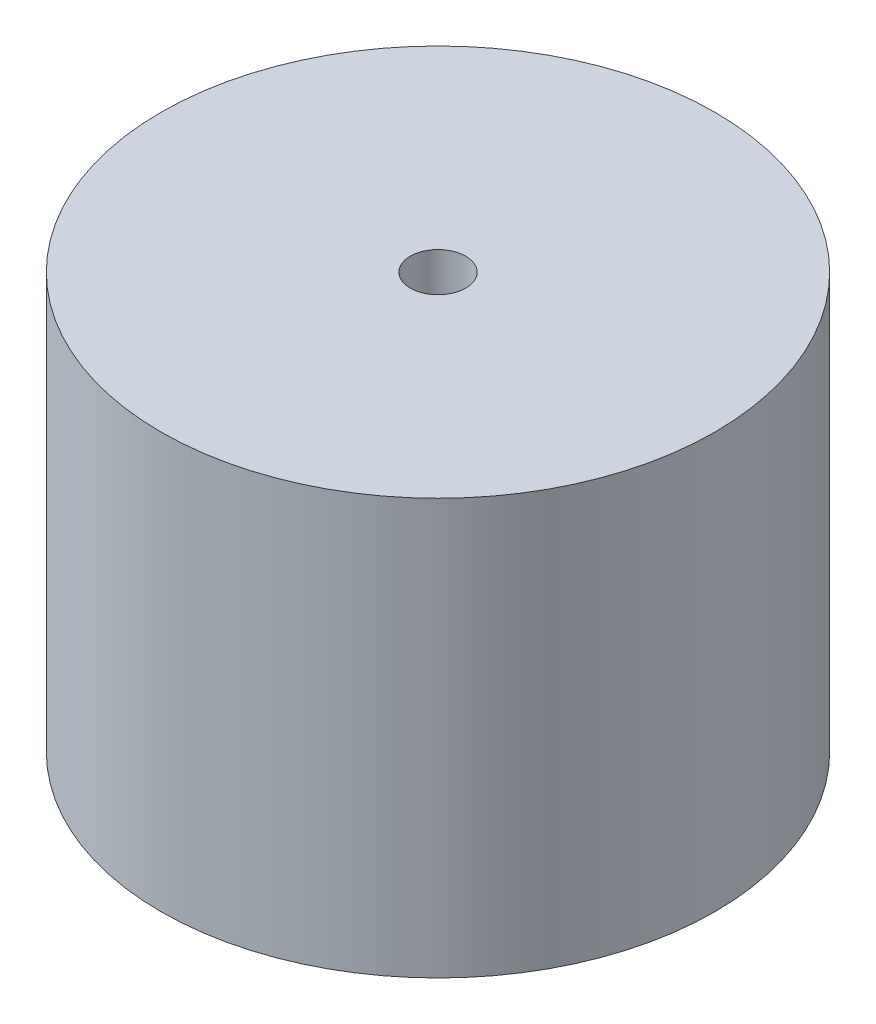
ISO-10303-21;
HEADER;
FILE_DESCRIPTION(('STEP AP214'),'2;1');
FILE_NAME('part.step','',(''),(''),'','','');
FILE_SCHEMA(('AUTOMOTIVE_DESIGN { 1 0 10303 214 1 1 1 1 }'));
ENDSEC;
DATA;
#1=APPLICATION_CONTEXT('core data for automotive mechanical design processes');
#2=APPLICATION_PROTOCOL_DEFINITION('international standard','automotive_design',2000,#1);
#3=PRODUCT_CONTEXT('',#1,'mechanical');
#4=PRODUCT('Part','Part','',(#3));
#5=PRODUCT_RELATED_PRODUCT_CATEGORY('part','',(#4));
#6=PRODUCT_DEFINITION_FORMATION('','',#4);
#7=PRODUCT_DEFINITION_CONTEXT('part definition',#1,'design');
#8=PRODUCT_DEFINITION('design','',#6,#7);
#9=PRODUCT_DEFINITION_SHAPE('','',#8);
#10=(LENGTH_UNIT() NAMED_UNIT(*) SI_UNIT(.MILLI.,.METRE.));
#11=(NAMED_UNIT(*) PLANE_ANGLE_UNIT() SI_UNIT($,.RADIAN.));
#12=(NAMED_UNIT(*) SI_UNIT($,.STERADIAN.) SOLID_ANGLE_UNIT());
#13=UNCERTAINTY_MEASURE_WITH_UNIT(LENGTH_MEASURE(1.E-05),#10,'distance_accuracy_value','');
#14=(GEOMETRIC_REPRESENTATION_CONTEXT(3) GLOBAL_UNCERTAINTY_ASSIGNED_CONTEXT((#13)) GLOBAL_UNIT_ASSIGNED_CONTEXT((#10,
#11,#12)) REPRESENTATION_CONTEXT('',''));
#15=CARTESIAN_POINT('',(0.,0.,0.));
#16=DIRECTION('',(0.,0.,1.));
#17=DIRECTION('',(1.,0.,0.));
#18=AXIS2_PLACEMENT_3D('',#15,#16,#17);
#19=CARTESIAN_POINT('',(0.,7.5,0.));
#20=DIRECTION('',(0.,-1.,0.));
#21=DIRECTION('',(0.,0.,-1.));
#22=AXIS2_PLACEMENT_3D('',#19,#20,#21);
#23=CYLINDRICAL_SURFACE('',#22,5.);
#24=CARTESIAN_POINT('',(0.,7.5,0.));
#25=DIRECTION('',(0.,1.,0.));
#26=DIRECTION('',(0.,0.,1.));
#27=AXIS2_PLACEMENT_3D('',#24,#25,#26);
#28=CIRCLE('',#27,5.);
#29=CARTESIAN_POINT('',(0.,7.5,5.));
#30=VERTEX_POINT('',#29);
#31=EDGE_CURVE('E10',#30,#30,#28,.T.);
#32=ORIENTED_EDGE('',*,*,#31,.F.);
#33=EDGE_LOOP('',(#32));
#34=FACE_BOUND('',#33,.T.);
#35=CARTESIAN_POINT('',(0.,0.,0.));
#36=DIRECTION('',(0.,1.,0.));
#37=DIRECTION('',(0.,0.,1.));
#38=AXIS2_PLACEMENT_3D('',#35,#36,#37);
#39=CIRCLE('',#38,5.);
#40=CARTESIAN_POINT('',(0.,0.,5.));
#41=VERTEX_POINT('',#40);
#42=EDGE_CURVE('E40',#41,#41,#39,.T.);
#43=ORIENTED_EDGE('',*,*,#42,.T.);
#44=EDGE_LOOP('',(#43));
#45=FACE_BOUND('',#44,.T.);
#46=ADVANCED_FACE('F33',(#34,#45),#23,.T.);
#47=CARTESIAN_POINT('',(0.,7.5,0.));
#48=DIRECTION('',(0.,1.,0.));
#49=DIRECTION('',(0.,0.,1.));
#50=AXIS2_PLACEMENT_3D('',#47,#48,#49);
#51=PLANE('',#50);
#52=CARTESIAN_POINT('',(0.,7.5,0.));
#53=DIRECTION('',(0.,1.,0.));
#54=DIRECTION('',(0.,0.,1.));
#55=AXIS2_PLACEMENT_3D('',#52,#53,#54);
#56=CIRCLE('',#55,0.5);
#57=CARTESIAN_POINT('',(0.,7.5,0.5));
#58=VERTEX_POINT('',#57);
#59=EDGE_CURVE('E52',#58,#58,#56,.T.);
#60=ORIENTED_EDGE('',*,*,#59,.F.);
#61=EDGE_LOOP('',(#60));
#62=FACE_BOUND('',#61,.T.);
#63=ORIENTED_EDGE('',*,*,#31,.T.);
#64=EDGE_LOOP('',(#63));
#65=FACE_BOUND('',#64,.T.);
#66=ADVANCED_FACE('F92',(#62,#65),#51,.T.);
#67=CARTESIAN_POINT('',(0.,0.,0.));
#68=DIRECTION('',(0.,1.,0.));
#69=DIRECTION('',(0.,0.,1.));
#70=AXIS2_PLACEMENT_3D('',#67,#68,#69);
#71=PLANE('',#70);
#72=CARTESIAN_POINT('',(0.,0.,3.875));
#73=DIRECTION('',(0.,1.,0.));
#74=DIRECTION('',(1.,0.,0.));
#75=AXIS2_PLACEMENT_3D('',#72,#73,#74);
#76=CIRCLE('',#75,0.35);
#77=CARTESIAN_POINT('',(0.350000000000013,0.,3.875));
#78=VERTEX_POINT('',#77);
#79=EDGE_CURVE('E74',#78,#78,#76,.T.);
#80=ORIENTED_EDGE('',*,*,#79,.T.);
#81=EDGE_LOOP('',(#80));
#82=FACE_BOUND('',#81,.T.);
#83=CARTESIAN_POINT('',(3.875,0.,0.));
#84=DIRECTION('',(0.,1.,0.));
#85=DIRECTION('',(0.,0.,-1.));
#86=AXIS2_PLACEMENT_3D('',#83,#84,#85);
#87=CIRCLE('',#86,0.35);
#88=CARTESIAN_POINT('',(3.875,0.,-0.35));
#89=VERTEX_POINT('',#88);
#90=EDGE_CURVE('E68',#89,#89,#87,.T.);
#91=ORIENTED_EDGE('',*,*,#90,.T.);
#92=EDGE_LOOP('',(#91));
#93=FACE_BOUND('',#92,.T.);
#94=CARTESIAN_POINT('',(0.,0.,-3.875));
#95=DIRECTION('',(0.,1.,0.));
#96=DIRECTION('',(-1.,0.,0.));
#97=AXIS2_PLACEMENT_3D('',#94,#95,#96);
#98=CIRCLE('',#97,0.35);
#99=CARTESIAN_POINT('',(-0.35000000000004,0.,-3.875));
#100=VERTEX_POINT('',#99);
#101=EDGE_CURVE('E62',#100,#100,#98,.T.);
#102=ORIENTED_EDGE('',*,*,#101,.T.);
#103=EDGE_LOOP('',(#102));
#104=FACE_BOUND('',#103,.T.);
#105=CARTESIAN_POINT('',(-3.875,0.,0.));
#106=DIRECTION('',(0.,1.,0.));
#107=DIRECTION('',(0.,0.,1.));
#108=AXIS2_PLACEMENT_3D('',#105,#106,#107);
#109=CIRCLE('',#108,0.35);
#110=CARTESIAN_POINT('',(-3.875,0.,0.35));
#111=VERTEX_POINT('',#110);
#112=EDGE_CURVE('E56',#111,#111,#109,.T.);
#113=ORIENTED_EDGE('',*,*,#112,.T.);
#114=EDGE_LOOP('',(#113));
#115=FACE_BOUND('',#114,.T.);
#116=CARTESIAN_POINT('',(0.,0.,0.));
#117=DIRECTION('',(0.,1.,0.));
#118=DIRECTION('',(0.,0.,1.));
#119=AXIS2_PLACEMENT_3D('',#116,#117,#118);
#120=CIRCLE('',#119,2.75);
#121=CARTESIAN_POINT('',(0.,0.,-2.75));
#122=VERTEX_POINT('',#121);
#123=EDGE_CURVE('E47',#122,#122,#120,.T.);
#124=ORIENTED_EDGE('',*,*,#123,.T.);
#125=EDGE_LOOP('',(#124));
#126=FACE_BOUND('',#125,.T.);
#127=ORIENTED_EDGE('',*,*,#42,.F.);
#128=EDGE_LOOP('',(#127));
#129=FACE_BOUND('',#128,.T.);
#130=ADVANCED_FACE('F97',(#82,#93,#104,#115,#126,#129),#71,.F.);
#131=CARTESIAN_POINT('',(0.,6.5,0.));
#132=DIRECTION('',(0.,-1.,0.));
#133=DIRECTION('',(0.,0.,-1.));
#134=AXIS2_PLACEMENT_3D('',#131,#132,#133);
#135=CYLINDRICAL_SURFACE('',#134,2.75);
#136=CARTESIAN_POINT('',(0.,6.5,0.));
#137=DIRECTION('',(0.,1.,0.));
#138=DIRECTION('',(0.,0.,1.));
#139=AXIS2_PLACEMENT_3D('',#136,#137,#138);
#140=CIRCLE('',#139,2.75);
#141=CARTESIAN_POINT('',(0.,6.5,-2.75));
#142=VERTEX_POINT('',#141);
#143=EDGE_CURVE('E45',#142,#142,#140,.T.);
#144=CARTESIAN_POINT('',(0.,6.5,-2.75));
#145=CARTESIAN_POINT('',(0.,6.43229166666667,-2.75));
#146=CARTESIAN_POINT('',(0.,6.36458333333333,-2.75));
#147=CARTESIAN_POINT('',(0.,6.22916666666667,-2.75));
#148=CARTESIAN_POINT('',(0.,6.16145833333333,-2.75));
#149=CARTESIAN_POINT('',(0.,6.02604166666667,-2.75));
#150=CARTESIAN_POINT('',(0.,5.95833333333333,-2.75));
#151=CARTESIAN_POINT('',(0.,5.82291666666667,-2.75));
#152=CARTESIAN_POINT('',(0.,5.75520833333333,-2.75));
#153=CARTESIAN_POINT('',(0.,5.61979166666667,-2.75));
#154=CARTESIAN_POINT('',(0.,5.55208333333333,-2.75));
#155=CARTESIAN_POINT('',(0.,5.41666666666667,-2.75));
#156=CARTESIAN_POINT('',(0.,5.34895833333333,-2.75));
#157=CARTESIAN_POINT('',(0.,5.21354166666667,-2.75));
#158=CARTESIAN_POINT('',(0.,5.14583333333333,-2.75));
#159=CARTESIAN_POINT('',(0.,5.01041666666667,-2.75));
#160=CARTESIAN_POINT('',(0.,4.94270833333333,-2.75));
#161=CARTESIAN_POINT('',(0.,4.80729166666667,-2.75));
#162=CARTESIAN_POINT('',(0.,4.73958333333333,-2.75));
#163=CARTESIAN_POINT('',(0.,4.60416666666667,-2.75));
#164=CARTESIAN_POINT('',(0.,4.53645833333333,-2.75));
#165=CARTESIAN_POINT('',(0.,4.40104166666667,-2.75));
#166=CARTESIAN_POINT('',(0.,4.33333333333333,-2.75));
#167=CARTESIAN_POINT('',(0.,4.19791666666667,-2.75));
#168=CARTESIAN_POINT('',(0.,4.13020833333333,-2.75));
#169=CARTESIAN_POINT('',(0.,3.99479166666667,-2.75));
#170=CARTESIAN_POINT('',(0.,3.92708333333333,-2.75));
#171=CARTESIAN_POINT('',(0.,3.79166666666667,-2.75));
#172=CARTESIAN_POINT('',(0.,3.72395833333333,-2.75));
#173=CARTESIAN_POINT('',(0.,3.58854166666667,-2.75));
#174=CARTESIAN_POINT('',(0.,3.52083333333333,-2.75));
#175=CARTESIAN_POINT('',(0.,3.38541666666667,-2.75));
#176=CARTESIAN_POINT('',(0.,3.31770833333333,-2.75));
#177=CARTESIAN_POINT('',(0.,3.18229166666667,-2.75));
#178=CARTESIAN_POINT('',(0.,3.11458333333333,-2.75));
#179=CARTESIAN_POINT('',(0.,2.97916666666667,-2.75));
#180=CARTESIAN_POINT('',(0.,2.91145833333333,-2.75));
#181=CARTESIAN_POINT('',(0.,2.77604166666667,-2.75));
#182=CARTESIAN_POINT('',(0.,2.70833333333333,-2.75));
#183=CARTESIAN_POINT('',(0.,2.57291666666667,-2.75));
#184=CARTESIAN_POINT('',(0.,2.50520833333333,-2.75));
#185=CARTESIAN_POINT('',(0.,2.36979166666667,-2.75));
#186=CARTESIAN_POINT('',(0.,2.30208333333333,-2.75));
#187=CARTESIAN_POINT('',(0.,2.16666666666667,-2.75));
#188=CARTESIAN_POINT('',(0.,2.09895833333333,-2.75));
#189=CARTESIAN_POINT('',(0.,1.96354166666667,-2.75));
#190=CARTESIAN_POINT('',(0.,1.89583333333333,-2.75));
#191=CARTESIAN_POINT('',(0.,1.76041666666667,-2.75));
#192=CARTESIAN_POINT('',(0.,1.69270833333333,-2.75));
#193=CARTESIAN_POINT('',(0.,1.55729166666667,-2.75));
#194=CARTESIAN_POINT('',(0.,1.48958333333333,-2.75));
#195=CARTESIAN_POINT('',(0.,1.35416666666667,-2.75));
#196=CARTESIAN_POINT('',(0.,1.28645833333333,-2.75));
#197=CARTESIAN_POINT('',(0.,1.15104166666667,-2.75));
#198=CARTESIAN_POINT('',(0.,1.08333333333333,-2.75));
#199=CARTESIAN_POINT('',(0.,0.947916666666667,-2.75));
#200=CARTESIAN_POINT('',(0.,0.880208333333333,-2.75));
#201=CARTESIAN_POINT('',(0.,0.744791666666667,-2.75));
#202=CARTESIAN_POINT('',(0.,0.677083333333333,-2.75));
#203=CARTESIAN_POINT('',(0.,0.541666666666667,-2.75));
#204=CARTESIAN_POINT('',(0.,0.473958333333333,-2.75));
#205=CARTESIAN_POINT('',(0.,0.338541666666667,-2.75));
#206=CARTESIAN_POINT('',(0.,0.270833333333334,-2.75));
#207=CARTESIAN_POINT('',(0.,0.135416666666667,-2.75));
#208=CARTESIAN_POINT('',(0.,0.0677083333333334,-2.75));
#209=CARTESIAN_POINT('',(0.,0.,-2.75));
#210=B_SPLINE_CURVE_WITH_KNOTS('',3,(#144,#145,#146,#147,#148,#149,#150,#151,#152,#153,#154,
#155,#156,#157,#158,#159,#160,#161,#162,#163,#164,#165,#166,#167,#168,#169,#170,#171,#172,#173,
#174,#175,#176,#177,#178,#179,#180,#181,#182,#183,#184,#185,#186,#187,#188,#189,#190,#191,#192,
#193,#194,#195,#196,#197,#198,#199,#200,#201,#202,#203,#204,#205,#206,#207,#208,#209),
.UNSPECIFIED.,.F.,.F.,(4,2,2,2,2,2,2,2,2,2,2,2,2,2,2,2,2,2,2,2,2,2,2,2,2,2,2,2,2,2,2,2,4),(0.,
0.203125,0.40625,0.609375000000001,0.812500000000001,1.015625,1.21875,1.421875,1.625,1.828125,
2.03125,2.234375,2.4375,2.640625,2.84375,3.046875,3.25,3.453125,3.65625,3.859375,4.0625,
4.265625,4.46875,4.671875,4.875,5.078125,5.28125,5.484375,5.6875,5.890625,6.09375,6.296875,6.5),.UNSPECIFIED.);
#211=EDGE_CURVE('BSEAM104',#142,#122,#210,.T.);
#212=ORIENTED_EDGE('',*,*,#143,.T.);
#213=ORIENTED_EDGE('',*,*,#123,.F.);
#214=ORIENTED_EDGE('',*,*,#211,.T.);
#215=ORIENTED_EDGE('',*,*,#211,.F.);
#216=EDGE_LOOP('',(#212,#214,#213,#215));
#217=FACE_BOUND('',#216,.T.);
#218=ADVANCED_FACE('F104',(#217),#135,.F.);
#219=CARTESIAN_POINT('',(0.,6.5,0.));
#220=DIRECTION('',(0.,1.,0.));
#221=DIRECTION('',(0.,0.,1.));
#222=AXIS2_PLACEMENT_3D('',#219,#220,#221);
#223=PLANE('',#222);
#224=CARTESIAN_POINT('',(0.,6.5,0.));
#225=DIRECTION('',(0.,1.,0.));
#226=DIRECTION('',(0.,0.,1.));
#227=AXIS2_PLACEMENT_3D('',#224,#225,#226);
#228=CIRCLE('',#227,0.5);
#229=CARTESIAN_POINT('',(0.,6.5,0.5));
#230=VERTEX_POINT('',#229);
#231=EDGE_CURVE('E36',#230,#230,#228,.F.);
#232=ORIENTED_EDGE('',*,*,#231,.F.);
#233=EDGE_LOOP('',(#232));
#234=FACE_BOUND('',#233,.T.);
#235=ORIENTED_EDGE('',*,*,#143,.F.);
#236=EDGE_LOOP('',(#235));
#237=FACE_BOUND('',#236,.T.);
#238=ADVANCED_FACE('F109',(#234,#237),#223,.F.);
#239=CARTESIAN_POINT('',(0.,7.5,0.));
#240=DIRECTION('',(0.,-1.,0.));
#241=DIRECTION('',(0.,0.,-1.));
#242=AXIS2_PLACEMENT_3D('',#239,#240,#241);
#243=CYLINDRICAL_SURFACE('',#242,0.5);
#244=ORIENTED_EDGE('',*,*,#59,.T.);
#245=EDGE_LOOP('',(#244));
#246=FACE_BOUND('',#245,.T.);
#247=ORIENTED_EDGE('',*,*,#231,.T.);
#248=EDGE_LOOP('',(#247));
#249=FACE_BOUND('',#248,.T.);
#250=ADVANCED_FACE('F116',(#246,#249),#243,.F.);
#251=CARTESIAN_POINT('',(-3.875,2.,0.));
#252=DIRECTION('',(0.,-1.,0.));
#253=DIRECTION('',(0.,0.,-1.));
#254=AXIS2_PLACEMENT_3D('',#251,#252,#253);
#255=CYLINDRICAL_SURFACE('',#254,0.35);
#256=CARTESIAN_POINT('',(-3.875,2.,0.));
#257=DIRECTION('',(0.,1.,0.));
#258=DIRECTION('',(0.,0.,1.));
#259=AXIS2_PLACEMENT_3D('',#256,#257,#258);
#260=CIRCLE('',#259,0.35);
#261=CARTESIAN_POINT('',(-3.875,2.,0.35));
#262=VERTEX_POINT('',#261);
#263=EDGE_CURVE('E55',#262,#262,#260,.T.);
#264=ORIENTED_EDGE('',*,*,#263,.T.);
#265=EDGE_LOOP('',(#264));
#266=FACE_BOUND('',#265,.T.);
#267=ORIENTED_EDGE('',*,*,#112,.F.);
#268=EDGE_LOOP('',(#267));
#269=FACE_BOUND('',#268,.T.);
#270=ADVANCED_FACE('F120',(#266,#269),#255,.F.);
#271=CARTESIAN_POINT('',(-3.875,2.,0.));
#272=DIRECTION('',(0.,1.,0.));
#273=DIRECTION('',(0.,0.,1.));
#274=AXIS2_PLACEMENT_3D('',#271,#272,#273);
#275=PLANE('',#274);
#276=ORIENTED_EDGE('',*,*,#263,.F.);
#277=EDGE_LOOP('',(#276));
#278=FACE_BOUND('',#277,.T.);
#279=ADVANCED_FACE('F124',(#278),#275,.F.);
#280=CARTESIAN_POINT('',(0.,2.,-3.875));
#281=DIRECTION('',(0.,-1.,0.));
#282=DIRECTION('',(0.,0.,-1.));
#283=AXIS2_PLACEMENT_3D('',#280,#281,#282);
#284=CYLINDRICAL_SURFACE('',#283,0.35);
#285=CARTESIAN_POINT('',(0.,2.,-3.875));
#286=DIRECTION('',(0.,1.,0.));
#287=DIRECTION('',(-1.,0.,0.));
#288=AXIS2_PLACEMENT_3D('',#285,#286,#287);
#289=CIRCLE('',#288,0.35);
#290=CARTESIAN_POINT('',(-0.35000000000004,2.,-3.875));
#291=VERTEX_POINT('',#290);
#292=EDGE_CURVE('E65',#291,#291,#289,.T.);
#293=ORIENTED_EDGE('',*,*,#292,.T.);
#294=EDGE_LOOP('',(#293));
#295=FACE_BOUND('',#294,.T.);
#296=ORIENTED_EDGE('',*,*,#101,.F.);
#297=EDGE_LOOP('',(#296));
#298=FACE_BOUND('',#297,.T.);
#299=ADVANCED_FACE('F128',(#295,#298),#284,.F.);
#300=CARTESIAN_POINT('',(0.,2.,-3.875));
#301=DIRECTION('',(0.,1.,0.));
#302=DIRECTION('',(-1.,0.,0.));
#303=AXIS2_PLACEMENT_3D('',#300,#301,#302);
#304=PLANE('',#303);
#305=ORIENTED_EDGE('',*,*,#292,.F.);
#306=EDGE_LOOP('',(#305));
#307=FACE_BOUND('',#306,.T.);
#308=ADVANCED_FACE('F132',(#307),#304,.F.);
#309=CARTESIAN_POINT('',(3.875,2.,0.));
#310=DIRECTION('',(0.,-1.,0.));
#311=DIRECTION('',(0.,0.,-1.));
#312=AXIS2_PLACEMENT_3D('',#309,#310,#311);
#313=CYLINDRICAL_SURFACE('',#312,0.35);
#314=CARTESIAN_POINT('',(3.875,2.,0.));
#315=DIRECTION('',(0.,1.,0.));
#316=DIRECTION('',(0.,0.,-1.));
#317=AXIS2_PLACEMENT_3D('',#314,#315,#316);
#318=CIRCLE('',#317,0.35);
#319=CARTESIAN_POINT('',(3.875,2.,-0.35));
#320=VERTEX_POINT('',#319);
#321=EDGE_CURVE('E71',#320,#320,#318,.T.);
#322=ORIENTED_EDGE('',*,*,#321,.T.);
#323=EDGE_LOOP('',(#322));
#324=FACE_BOUND('',#323,.T.);
#325=ORIENTED_EDGE('',*,*,#90,.F.);
#326=EDGE_LOOP('',(#325));
#327=FACE_BOUND('',#326,.T.);
#328=ADVANCED_FACE('F136',(#324,#327),#313,.F.);
#329=CARTESIAN_POINT('',(3.875,2.,0.));
#330=DIRECTION('',(0.,1.,0.));
#331=DIRECTION('',(0.,0.,-1.));
#332=AXIS2_PLACEMENT_3D('',#329,#330,#331);
#333=PLANE('',#332);
#334=ORIENTED_EDGE('',*,*,#321,.F.);
#335=EDGE_LOOP('',(#334));
#336=FACE_BOUND('',#335,.T.);
#337=ADVANCED_FACE('F89',(#336),#333,.F.);
#338=CARTESIAN_POINT('',(0.,2.,3.875));
#339=DIRECTION('',(0.,-1.,0.));
#340=DIRECTION('',(0.,0.,-1.));
#341=AXIS2_PLACEMENT_3D('',#338,#339,#340);
#342=CYLINDRICAL_SURFACE('',#341,0.35);
#343=CARTESIAN_POINT('',(0.,2.,3.875));
#344=DIRECTION('',(0.,1.,0.));
#345=DIRECTION('',(1.,0.,0.));
#346=AXIS2_PLACEMENT_3D('',#343,#344,#345);
#347=CIRCLE('',#346,0.35);
#348=CARTESIAN_POINT('',(0.350000000000013,2.,3.875));
#349=VERTEX_POINT('',#348);
#350=EDGE_CURVE('E59',#349,#349,#347,.T.);
#351=ORIENTED_EDGE('',*,*,#350,.T.);
#352=EDGE_LOOP('',(#351));
#353=FACE_BOUND('',#352,.T.);
#354=ORIENTED_EDGE('',*,*,#79,.F.);
#355=EDGE_LOOP('',(#354));
#356=FACE_BOUND('',#355,.T.);
#357=ADVANCED_FACE('F80',(#353,#356),#342,.F.);
#358=CARTESIAN_POINT('',(0.,2.,3.875));
#359=DIRECTION('',(0.,1.,0.));
#360=DIRECTION('',(1.,0.,0.));
#361=AXIS2_PLACEMENT_3D('',#358,#359,#360);
#362=PLANE('',#361);
#363=ORIENTED_EDGE('',*,*,#350,.F.);
#364=EDGE_LOOP('',(#363));
#365=FACE_BOUND('',#364,.T.);
#366=ADVANCED_FACE('F83',(#365),#362,.F.);
#367=CLOSED_SHELL('',(#46,#66,#130,#218,#238,#250,#270,#279,#299,#308,#328,#337,#357,#366));
#368=MANIFOLD_SOLID_BREP('B2',#367);
#369=ADVANCED_BREP_SHAPE_REPRESENTATION('',(#18,#368),#14);
#370=SHAPE_DEFINITION_REPRESENTATION(#9,#369);
ENDSEC;
END-ISO-10303-21;
